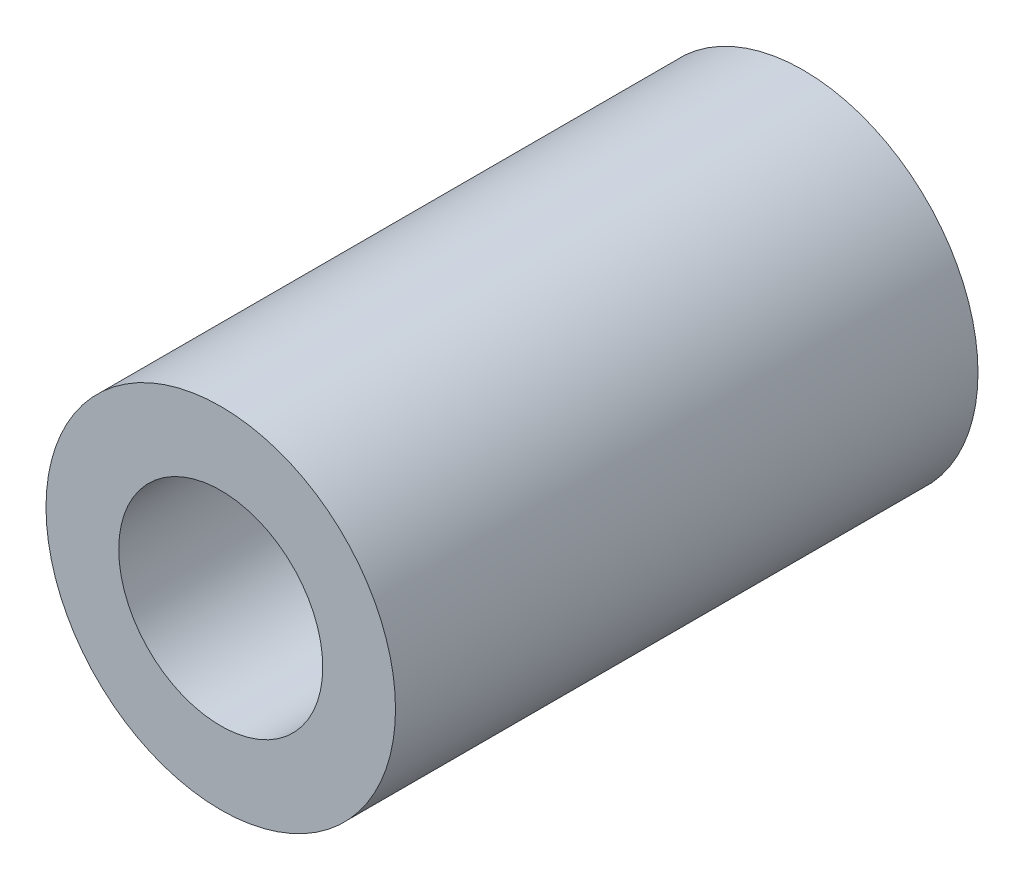
ISO-10303-21;
HEADER;
FILE_DESCRIPTION(('STEP AP214'),'2;1');
FILE_NAME('part.step','',(''),(''),'','','');
FILE_SCHEMA(('AUTOMOTIVE_DESIGN { 1 0 10303 214 1 1 1 1 }'));
ENDSEC;
DATA;
#1=APPLICATION_CONTEXT('core data for automotive mechanical design processes');
#2=APPLICATION_PROTOCOL_DEFINITION('international standard','automotive_design',2000,#1);
#3=PRODUCT_CONTEXT('',#1,'mechanical');
#4=PRODUCT('Part','Part','',(#3));
#5=PRODUCT_RELATED_PRODUCT_CATEGORY('part','',(#4));
#6=PRODUCT_DEFINITION_FORMATION('','',#4);
#7=PRODUCT_DEFINITION_CONTEXT('part definition',#1,'design');
#8=PRODUCT_DEFINITION('design','',#6,#7);
#9=PRODUCT_DEFINITION_SHAPE('','',#8);
#10=(LENGTH_UNIT() NAMED_UNIT(*) SI_UNIT(.MILLI.,.METRE.));
#11=(NAMED_UNIT(*) PLANE_ANGLE_UNIT() SI_UNIT($,.RADIAN.));
#12=(NAMED_UNIT(*) SI_UNIT($,.STERADIAN.) SOLID_ANGLE_UNIT());
#13=UNCERTAINTY_MEASURE_WITH_UNIT(LENGTH_MEASURE(1.E-05),#10,'distance_accuracy_value','');
#14=(GEOMETRIC_REPRESENTATION_CONTEXT(3) GLOBAL_UNCERTAINTY_ASSIGNED_CONTEXT((#13)) GLOBAL_UNIT_ASSIGNED_CONTEXT((#10,
#11,#12)) REPRESENTATION_CONTEXT('',''));
#15=CARTESIAN_POINT('',(0.,0.,0.));
#16=DIRECTION('',(0.,0.,1.));
#17=DIRECTION('',(1.,0.,0.));
#18=AXIS2_PLACEMENT_3D('',#15,#16,#17);
#19=CARTESIAN_POINT('',(0.,0.,15.875));
#20=DIRECTION('',(0.,0.,1.));
#21=DIRECTION('',(1.,0.,0.));
#22=AXIS2_PLACEMENT_3D('',#19,#20,#21);
#23=PLANE('',#22);
#24=CARTESIAN_POINT('',(0.,0.,15.875));
#25=DIRECTION('',(0.,0.,1.));
#26=DIRECTION('',(1.,0.,0.));
#27=AXIS2_PLACEMENT_3D('',#24,#25,#26);
#28=CIRCLE('',#27,4.7625);
#29=CARTESIAN_POINT('',(4.7625,0.,15.875));
#30=VERTEX_POINT('',#29);
#31=EDGE_CURVE('E10',#30,#30,#28,.T.);
#32=ORIENTED_EDGE('',*,*,#31,.T.);
#33=EDGE_LOOP('',(#32));
#34=FACE_BOUND('',#33,.T.);
#35=CARTESIAN_POINT('',(0.,0.,15.875));
#36=DIRECTION('',(0.,0.,1.));
#37=DIRECTION('',(1.,0.,0.));
#38=AXIS2_PLACEMENT_3D('',#35,#36,#37);
#39=CIRCLE('',#38,2.78);
#40=CARTESIAN_POINT('',(2.78,0.,15.875));
#41=VERTEX_POINT('',#40);
#42=EDGE_CURVE('E41',#41,#41,#39,.T.);
#43=ORIENTED_EDGE('',*,*,#42,.F.);
#44=EDGE_LOOP('',(#43));
#45=FACE_BOUND('',#44,.T.);
#46=ADVANCED_FACE('F30',(#34,#45),#23,.T.);
#47=CARTESIAN_POINT('',(0.,0.,0.));
#48=DIRECTION('',(0.,0.,1.));
#49=DIRECTION('',(1.,0.,0.));
#50=AXIS2_PLACEMENT_3D('',#47,#48,#49);
#51=PLANE('',#50);
#52=CARTESIAN_POINT('',(0.,0.,0.));
#53=DIRECTION('',(0.,0.,1.));
#54=DIRECTION('',(1.,0.,0.));
#55=AXIS2_PLACEMENT_3D('',#52,#53,#54);
#56=CIRCLE('',#55,4.7625);
#57=CARTESIAN_POINT('',(4.7625,0.,0.));
#58=VERTEX_POINT('',#57);
#59=EDGE_CURVE('E34',#58,#58,#56,.T.);
#60=ORIENTED_EDGE('',*,*,#59,.F.);
#61=EDGE_LOOP('',(#60));
#62=FACE_BOUND('',#61,.T.);
#63=CARTESIAN_POINT('',(0.,0.,0.));
#64=DIRECTION('',(0.,0.,1.));
#65=DIRECTION('',(1.,0.,0.));
#66=AXIS2_PLACEMENT_3D('',#63,#64,#65);
#67=CIRCLE('',#66,2.78);
#68=CARTESIAN_POINT('',(2.78,0.,0.));
#69=VERTEX_POINT('',#68);
#70=EDGE_CURVE('E43',#69,#69,#67,.T.);
#71=ORIENTED_EDGE('',*,*,#70,.T.);
#72=EDGE_LOOP('',(#71));
#73=FACE_BOUND('',#72,.T.);
#74=ADVANCED_FACE('F53',(#62,#73),#51,.F.);
#75=CARTESIAN_POINT('',(0.,0.,15.875));
#76=DIRECTION('',(0.,0.,-1.));
#77=DIRECTION('',(-1.,0.,0.));
#78=AXIS2_PLACEMENT_3D('',#75,#76,#77);
#79=CYLINDRICAL_SURFACE('',#78,4.7625);
#80=ORIENTED_EDGE('',*,*,#31,.F.);
#81=EDGE_LOOP('',(#80));
#82=FACE_BOUND('',#81,.T.);
#83=ORIENTED_EDGE('',*,*,#59,.T.);
#84=EDGE_LOOP('',(#83));
#85=FACE_BOUND('',#84,.T.);
#86=ADVANCED_FACE('F32',(#82,#85),#79,.T.);
#87=CARTESIAN_POINT('',(0.,0.,15.875));
#88=DIRECTION('',(0.,0.,-1.));
#89=DIRECTION('',(-1.,0.,0.));
#90=AXIS2_PLACEMENT_3D('',#87,#88,#89);
#91=CYLINDRICAL_SURFACE('',#90,2.78);
#92=ORIENTED_EDGE('',*,*,#42,.T.);
#93=EDGE_LOOP('',(#92));
#94=FACE_BOUND('',#93,.T.);
#95=ORIENTED_EDGE('',*,*,#70,.F.);
#96=EDGE_LOOP('',(#95));
#97=FACE_BOUND('',#96,.T.);
#98=ADVANCED_FACE('F49',(#94,#97),#91,.F.);
#99=CLOSED_SHELL('',(#46,#74,#86,#98));
#100=MANIFOLD_SOLID_BREP('B2',#99);
#101=ADVANCED_BREP_SHAPE_REPRESENTATION('',(#18,#100),#14);
#102=SHAPE_DEFINITION_REPRESENTATION(#9,#101);
ENDSEC;
END-ISO-10303-21;
